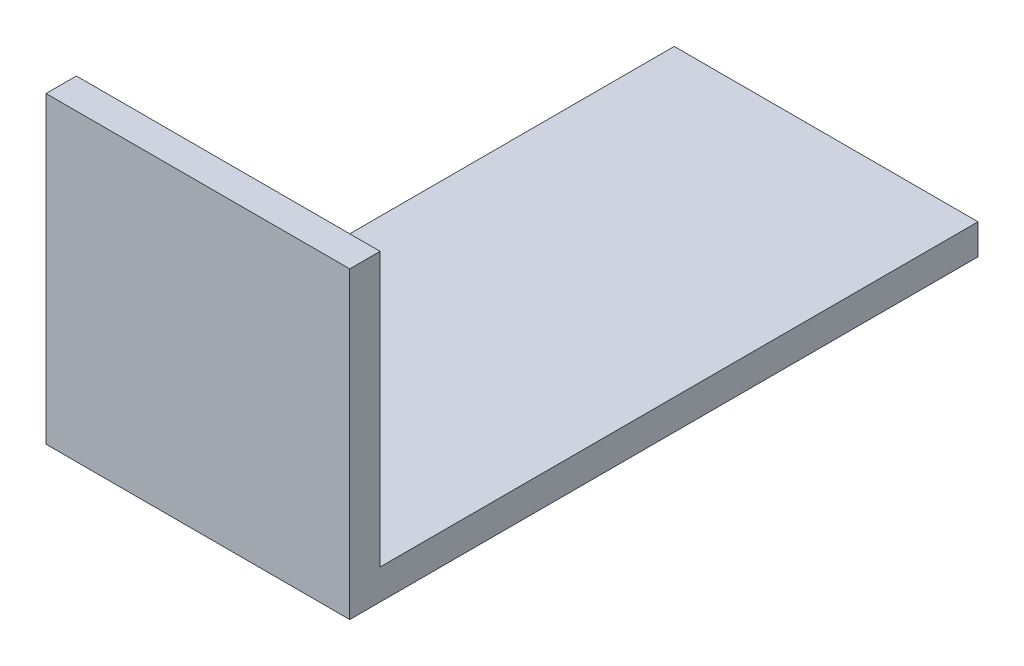
ISO-10303-21;
HEADER;
FILE_DESCRIPTION(('STEP AP214'),'2;1');
FILE_NAME('part.step','',(''),(''),'','','');
FILE_SCHEMA(('AUTOMOTIVE_DESIGN { 1 0 10303 214 1 1 1 1 }'));
ENDSEC;
DATA;
#1=APPLICATION_CONTEXT('core data for automotive mechanical design processes');
#2=APPLICATION_PROTOCOL_DEFINITION('international standard','automotive_design',2000,#1);
#3=PRODUCT_CONTEXT('',#1,'mechanical');
#4=PRODUCT('Part','Part','',(#3));
#5=PRODUCT_RELATED_PRODUCT_CATEGORY('part','',(#4));
#6=PRODUCT_DEFINITION_FORMATION('','',#4);
#7=PRODUCT_DEFINITION_CONTEXT('part definition',#1,'design');
#8=PRODUCT_DEFINITION('design','',#6,#7);
#9=PRODUCT_DEFINITION_SHAPE('','',#8);
#10=(LENGTH_UNIT() NAMED_UNIT(*) SI_UNIT(.MILLI.,.METRE.));
#11=(NAMED_UNIT(*) PLANE_ANGLE_UNIT() SI_UNIT($,.RADIAN.));
#12=(NAMED_UNIT(*) SI_UNIT($,.STERADIAN.) SOLID_ANGLE_UNIT());
#13=UNCERTAINTY_MEASURE_WITH_UNIT(LENGTH_MEASURE(1.E-05),#10,'distance_accuracy_value','');
#14=(GEOMETRIC_REPRESENTATION_CONTEXT(3) GLOBAL_UNCERTAINTY_ASSIGNED_CONTEXT((#13)) GLOBAL_UNIT_ASSIGNED_CONTEXT((#10,
#11,#12)) REPRESENTATION_CONTEXT('',''));
#15=CARTESIAN_POINT('',(0.,0.,0.));
#16=DIRECTION('',(0.,0.,1.));
#17=DIRECTION('',(1.,0.,0.));
#18=AXIS2_PLACEMENT_3D('',#15,#16,#17);
#19=CARTESIAN_POINT('',(63.5,0.,0.));
#20=DIRECTION('',(0.,0.,1.));
#21=DIRECTION('',(0.,-1.,0.));
#22=AXIS2_PLACEMENT_3D('',#19,#20,#21);
#23=PLANE('',#22);
#24=DIRECTION('',(0.,1.,0.));
#25=VECTOR('',#24,1.);
#26=CARTESIAN_POINT('',(-63.5,0.,0.));
#27=LINE('',#26,#25);
#28=CARTESIAN_POINT('',(-63.5,0.,0.));
#29=VERTEX_POINT('',#28);
#30=CARTESIAN_POINT('',(-63.5,114.3,0.));
#31=VERTEX_POINT('',#30);
#32=EDGE_CURVE('E131',#29,#31,#27,.T.);
#33=ORIENTED_EDGE('',*,*,#32,.T.);
#34=DIRECTION('',(-1.,0.,0.));
#35=VECTOR('',#34,1.);
#36=CARTESIAN_POINT('',(63.5,114.3,0.));
#37=LINE('',#36,#35);
#38=CARTESIAN_POINT('',(63.5,114.3,0.));
#39=VERTEX_POINT('',#38);
#40=EDGE_CURVE('E11',#39,#31,#37,.T.);
#41=ORIENTED_EDGE('',*,*,#40,.F.);
#42=DIRECTION('',(0.,1.,0.));
#43=VECTOR('',#42,1.);
#44=CARTESIAN_POINT('',(63.5,0.,0.));
#45=LINE('',#44,#43);
#46=CARTESIAN_POINT('',(63.5,0.,0.));
#47=VERTEX_POINT('',#46);
#48=EDGE_CURVE('E148',#47,#39,#45,.T.);
#49=ORIENTED_EDGE('',*,*,#48,.F.);
#50=DIRECTION('',(-1.,0.,0.));
#51=VECTOR('',#50,1.);
#52=CARTESIAN_POINT('',(63.5,0.,0.));
#53=LINE('',#52,#51);
#54=EDGE_CURVE('E127',#47,#29,#53,.T.);
#55=ORIENTED_EDGE('',*,*,#54,.T.);
#56=EDGE_LOOP('',(#33,#41,#49,#55));
#57=FACE_BOUND('',#56,.T.);
#58=ADVANCED_FACE('F43',(#57),#23,.F.);
#59=CARTESIAN_POINT('',(63.5,114.3,0.));
#60=DIRECTION('',(0.,-1.,0.));
#61=DIRECTION('',(0.,0.,-1.));
#62=AXIS2_PLACEMENT_3D('',#59,#60,#61);
#63=PLANE('',#62);
#64=DIRECTION('',(0.,0.,1.));
#65=VECTOR('',#64,1.);
#66=CARTESIAN_POINT('',(-63.5,114.3,0.));
#67=LINE('',#66,#65);
#68=CARTESIAN_POINT('',(-63.5,114.3,12.7));
#69=VERTEX_POINT('',#68);
#70=EDGE_CURVE('E135',#31,#69,#67,.T.);
#71=ORIENTED_EDGE('',*,*,#70,.T.);
#72=DIRECTION('',(-1.,0.,0.));
#73=VECTOR('',#72,1.);
#74=CARTESIAN_POINT('',(63.5,114.3,12.7));
#75=LINE('',#74,#73);
#76=CARTESIAN_POINT('',(63.5,114.3,12.7));
#77=VERTEX_POINT('',#76);
#78=EDGE_CURVE('E52',#77,#69,#75,.T.);
#79=ORIENTED_EDGE('',*,*,#78,.F.);
#80=DIRECTION('',(0.,0.,1.));
#81=VECTOR('',#80,1.);
#82=CARTESIAN_POINT('',(63.5,114.3,0.));
#83=LINE('',#82,#81);
#84=EDGE_CURVE('E97',#39,#77,#83,.T.);
#85=ORIENTED_EDGE('',*,*,#84,.F.);
#86=ORIENTED_EDGE('',*,*,#40,.T.);
#87=EDGE_LOOP('',(#71,#79,#85,#86));
#88=FACE_BOUND('',#87,.T.);
#89=ADVANCED_FACE('F176',(#88),#63,.F.);
#90=CARTESIAN_POINT('',(63.5,-12.7,12.7));
#91=DIRECTION('',(0.,0.,-1.));
#92=DIRECTION('',(0.,1.,0.));
#93=AXIS2_PLACEMENT_3D('',#90,#91,#92);
#94=PLANE('',#93);
#95=DIRECTION('',(0.,-1.,0.));
#96=VECTOR('',#95,1.);
#97=CARTESIAN_POINT('',(-63.5,-12.7,12.7));
#98=LINE('',#97,#96);
#99=CARTESIAN_POINT('',(-63.5,-12.7,12.7));
#100=VERTEX_POINT('',#99);
#101=EDGE_CURVE('E138',#69,#100,#98,.T.);
#102=ORIENTED_EDGE('',*,*,#101,.T.);
#103=DIRECTION('',(-1.,0.,0.));
#104=VECTOR('',#103,1.);
#105=CARTESIAN_POINT('',(63.5,-12.7,12.7));
#106=LINE('',#105,#104);
#107=CARTESIAN_POINT('',(63.5,-12.7,12.7));
#108=VERTEX_POINT('',#107);
#109=EDGE_CURVE('E120',#108,#100,#106,.T.);
#110=ORIENTED_EDGE('',*,*,#109,.F.);
#111=DIRECTION('',(0.,-1.,0.));
#112=VECTOR('',#111,1.);
#113=CARTESIAN_POINT('',(63.5,-12.7,12.7));
#114=LINE('',#113,#112);
#115=EDGE_CURVE('E110',#77,#108,#114,.T.);
#116=ORIENTED_EDGE('',*,*,#115,.F.);
#117=ORIENTED_EDGE('',*,*,#78,.T.);
#118=EDGE_LOOP('',(#102,#110,#116,#117));
#119=FACE_BOUND('',#118,.T.);
#120=ADVANCED_FACE('F158',(#119),#94,.F.);
#121=CARTESIAN_POINT('',(63.5,-12.7,0.));
#122=DIRECTION('',(0.,1.,0.));
#123=DIRECTION('',(0.,0.,1.));
#124=AXIS2_PLACEMENT_3D('',#121,#122,#123);
#125=PLANE('',#124);
#126=DIRECTION('',(0.,0.,-1.));
#127=VECTOR('',#126,1.);
#128=CARTESIAN_POINT('',(-63.5,-12.7,0.));
#129=LINE('',#128,#127);
#130=CARTESIAN_POINT('',(-63.5,-12.7,-250.));
#131=VERTEX_POINT('',#130);
#132=EDGE_CURVE('E118',#100,#131,#129,.T.);
#133=ORIENTED_EDGE('',*,*,#132,.T.);
#134=DIRECTION('',(-1.,0.,0.));
#135=VECTOR('',#134,1.);
#136=CARTESIAN_POINT('',(63.5,-12.7,-250.));
#137=LINE('',#136,#135);
#138=CARTESIAN_POINT('',(63.5,-12.7,-250.));
#139=VERTEX_POINT('',#138);
#140=EDGE_CURVE('E116',#139,#131,#137,.T.);
#141=ORIENTED_EDGE('',*,*,#140,.F.);
#142=DIRECTION('',(0.,0.,-1.));
#143=VECTOR('',#142,1.);
#144=CARTESIAN_POINT('',(63.5,-12.7,0.));
#145=LINE('',#144,#143);
#146=EDGE_CURVE('E104',#108,#139,#145,.T.);
#147=ORIENTED_EDGE('',*,*,#146,.F.);
#148=ORIENTED_EDGE('',*,*,#109,.T.);
#149=EDGE_LOOP('',(#133,#141,#147,#148));
#150=FACE_BOUND('',#149,.T.);
#151=ADVANCED_FACE('F117',(#150),#125,.F.);
#152=CARTESIAN_POINT('',(63.5,0.,-250.));
#153=DIRECTION('',(0.,0.,1.));
#154=DIRECTION('',(1.,0.,0.));
#155=AXIS2_PLACEMENT_3D('',#152,#153,#154);
#156=PLANE('',#155);
#157=DIRECTION('',(0.,1.,0.));
#158=VECTOR('',#157,1.);
#159=CARTESIAN_POINT('',(-63.5,0.,-250.));
#160=LINE('',#159,#158);
#161=CARTESIAN_POINT('',(-63.5,0.,-250.));
#162=VERTEX_POINT('',#161);
#163=EDGE_CURVE('E83',#131,#162,#160,.T.);
#164=ORIENTED_EDGE('',*,*,#163,.T.);
#165=DIRECTION('',(-1.,0.,0.));
#166=VECTOR('',#165,1.);
#167=CARTESIAN_POINT('',(63.5,0.,-250.));
#168=LINE('',#167,#166);
#169=CARTESIAN_POINT('',(63.5,0.,-250.));
#170=VERTEX_POINT('',#169);
#171=EDGE_CURVE('E121',#170,#162,#168,.T.);
#172=ORIENTED_EDGE('',*,*,#171,.F.);
#173=DIRECTION('',(0.,1.,0.));
#174=VECTOR('',#173,1.);
#175=CARTESIAN_POINT('',(63.5,0.,-250.));
#176=LINE('',#175,#174);
#177=EDGE_CURVE('E108',#139,#170,#176,.T.);
#178=ORIENTED_EDGE('',*,*,#177,.F.);
#179=ORIENTED_EDGE('',*,*,#140,.T.);
#180=EDGE_LOOP('',(#164,#172,#178,#179));
#181=FACE_BOUND('',#180,.T.);
#182=ADVANCED_FACE('F123',(#181),#156,.F.);
#183=CARTESIAN_POINT('',(63.5,0.,0.));
#184=DIRECTION('',(0.,-1.,0.));
#185=DIRECTION('',(0.,0.,-1.));
#186=AXIS2_PLACEMENT_3D('',#183,#184,#185);
#187=PLANE('',#186);
#188=DIRECTION('',(0.,0.,1.));
#189=VECTOR('',#188,1.);
#190=CARTESIAN_POINT('',(-63.5,0.,0.));
#191=LINE('',#190,#189);
#192=EDGE_CURVE('E89',#162,#29,#191,.T.);
#193=ORIENTED_EDGE('',*,*,#192,.T.);
#194=ORIENTED_EDGE('',*,*,#54,.F.);
#195=DIRECTION('',(0.,0.,1.));
#196=VECTOR('',#195,1.);
#197=CARTESIAN_POINT('',(63.5,0.,0.));
#198=LINE('',#197,#196);
#199=EDGE_CURVE('E60',#170,#47,#198,.T.);
#200=ORIENTED_EDGE('',*,*,#199,.F.);
#201=ORIENTED_EDGE('',*,*,#171,.T.);
#202=EDGE_LOOP('',(#193,#194,#200,#201));
#203=FACE_BOUND('',#202,.T.);
#204=ADVANCED_FACE('F165',(#203),#187,.F.);
#205=CARTESIAN_POINT('',(63.5,0.,0.));
#206=DIRECTION('',(1.,0.,0.));
#207=DIRECTION('',(0.,0.,-1.));
#208=AXIS2_PLACEMENT_3D('',#205,#206,#207);
#209=PLANE('',#208);
#210=ORIENTED_EDGE('',*,*,#48,.T.);
#211=ORIENTED_EDGE('',*,*,#84,.T.);
#212=ORIENTED_EDGE('',*,*,#115,.T.);
#213=ORIENTED_EDGE('',*,*,#146,.T.);
#214=ORIENTED_EDGE('',*,*,#177,.T.);
#215=ORIENTED_EDGE('',*,*,#199,.T.);
#216=EDGE_LOOP('',(#210,#211,#212,#213,#214,#215));
#217=FACE_BOUND('',#216,.T.);
#218=ADVANCED_FACE('F106',(#217),#209,.T.);
#219=CARTESIAN_POINT('',(-63.5,0.,0.));
#220=DIRECTION('',(1.,0.,0.));
#221=DIRECTION('',(0.,0.,-1.));
#222=AXIS2_PLACEMENT_3D('',#219,#220,#221);
#223=PLANE('',#222);
#224=ORIENTED_EDGE('',*,*,#32,.F.);
#225=ORIENTED_EDGE('',*,*,#192,.F.);
#226=ORIENTED_EDGE('',*,*,#163,.F.);
#227=ORIENTED_EDGE('',*,*,#132,.F.);
#228=ORIENTED_EDGE('',*,*,#101,.F.);
#229=ORIENTED_EDGE('',*,*,#70,.F.);
#230=EDGE_LOOP('',(#224,#225,#226,#227,#228,#229));
#231=FACE_BOUND('',#230,.T.);
#232=ADVANCED_FACE('F161',(#231),#223,.F.);
#233=CLOSED_SHELL('',(#58,#89,#120,#151,#182,#204,#218,#232));
#234=MANIFOLD_SOLID_BREP('B2',#233);
#235=ADVANCED_BREP_SHAPE_REPRESENTATION('',(#18,#234),#14);
#236=SHAPE_DEFINITION_REPRESENTATION(#9,#235);
ENDSEC;
END-ISO-10303-21;
